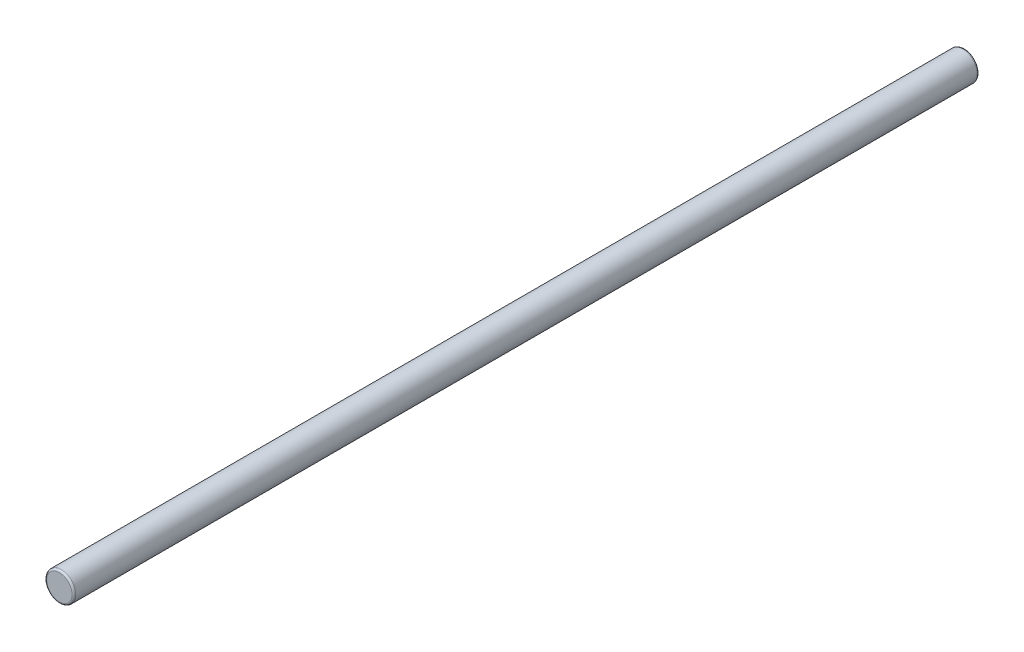
ISO-10303-21;
HEADER;
FILE_DESCRIPTION(('STEP AP214'),'2;1');
FILE_NAME('part.step','',(''),(''),'','','');
FILE_SCHEMA(('AUTOMOTIVE_DESIGN { 1 0 10303 214 1 1 1 1 }'));
ENDSEC;
DATA;
#1=APPLICATION_CONTEXT('core data for automotive mechanical design processes');
#2=APPLICATION_PROTOCOL_DEFINITION('international standard','automotive_design',2000,#1);
#3=PRODUCT_CONTEXT('',#1,'mechanical');
#4=PRODUCT('Part','Part','',(#3));
#5=PRODUCT_RELATED_PRODUCT_CATEGORY('part','',(#4));
#6=PRODUCT_DEFINITION_FORMATION('','',#4);
#7=PRODUCT_DEFINITION_CONTEXT('part definition',#1,'design');
#8=PRODUCT_DEFINITION('design','',#6,#7);
#9=PRODUCT_DEFINITION_SHAPE('','',#8);
#10=(LENGTH_UNIT() NAMED_UNIT(*) SI_UNIT(.MILLI.,.METRE.));
#11=(NAMED_UNIT(*) PLANE_ANGLE_UNIT() SI_UNIT($,.RADIAN.));
#12=(NAMED_UNIT(*) SI_UNIT($,.STERADIAN.) SOLID_ANGLE_UNIT());
#13=UNCERTAINTY_MEASURE_WITH_UNIT(LENGTH_MEASURE(1.E-05),#10,'distance_accuracy_value','');
#14=(GEOMETRIC_REPRESENTATION_CONTEXT(3) GLOBAL_UNCERTAINTY_ASSIGNED_CONTEXT((#13)) GLOBAL_UNIT_ASSIGNED_CONTEXT((#10,
#11,#12)) REPRESENTATION_CONTEXT('',''));
#15=CARTESIAN_POINT('',(0.,0.,0.));
#16=DIRECTION('',(0.,0.,1.));
#17=DIRECTION('',(1.,0.,0.));
#18=AXIS2_PLACEMENT_3D('',#15,#16,#17);
#19=CARTESIAN_POINT('',(0.,0.,250.));
#20=DIRECTION('',(0.,0.,-1.));
#21=DIRECTION('',(-1.,0.,0.));
#22=AXIS2_PLACEMENT_3D('',#19,#20,#21);
#23=CYLINDRICAL_SURFACE('',#22,4.);
#24=CARTESIAN_POINT('',(0.,0.,249.5));
#25=DIRECTION('',(0.,0.,1.));
#26=DIRECTION('',(1.,0.,0.));
#27=AXIS2_PLACEMENT_3D('',#24,#25,#26);
#28=CIRCLE('',#27,4.);
#29=CARTESIAN_POINT('',(4.,0.,249.5));
#30=VERTEX_POINT('',#29);
#31=EDGE_CURVE('E45',#30,#30,#28,.F.);
#32=ORIENTED_EDGE('',*,*,#31,.T.);
#33=EDGE_LOOP('',(#32));
#34=FACE_BOUND('',#33,.T.);
#35=CARTESIAN_POINT('',(0.,0.,0.5));
#36=DIRECTION('',(0.,0.,1.));
#37=DIRECTION('',(1.,0.,0.));
#38=AXIS2_PLACEMENT_3D('',#35,#36,#37);
#39=CIRCLE('',#38,4.);
#40=CARTESIAN_POINT('',(4.,0.,0.5));
#41=VERTEX_POINT('',#40);
#42=EDGE_CURVE('E50',#41,#41,#39,.T.);
#43=ORIENTED_EDGE('',*,*,#42,.T.);
#44=EDGE_LOOP('',(#43));
#45=FACE_BOUND('',#44,.T.);
#46=ADVANCED_FACE('F37',(#34,#45),#23,.T.);
#47=CARTESIAN_POINT('',(0.,0.,250.));
#48=DIRECTION('',(0.,0.,1.));
#49=DIRECTION('',(1.,0.,0.));
#50=AXIS2_PLACEMENT_3D('',#47,#48,#49);
#51=PLANE('',#50);
#52=CARTESIAN_POINT('',(0.,0.,250.));
#53=DIRECTION('',(0.,0.,1.));
#54=DIRECTION('',(1.,0.,0.));
#55=AXIS2_PLACEMENT_3D('',#52,#53,#54);
#56=CIRCLE('',#55,3.5);
#57=CARTESIAN_POINT('',(3.5,0.,250.));
#58=VERTEX_POINT('',#57);
#59=EDGE_CURVE('E55',#58,#58,#56,.T.);
#60=ORIENTED_EDGE('',*,*,#59,.T.);
#61=EDGE_LOOP('',(#60));
#62=FACE_BOUND('',#61,.T.);
#63=ADVANCED_FACE('F62',(#62),#51,.T.);
#64=CARTESIAN_POINT('',(0.,0.,0.));
#65=DIRECTION('',(0.,0.,1.));
#66=DIRECTION('',(1.,0.,0.));
#67=AXIS2_PLACEMENT_3D('',#64,#65,#66);
#68=PLANE('',#67);
#69=CARTESIAN_POINT('',(0.,0.,0.));
#70=DIRECTION('',(0.,0.,1.));
#71=DIRECTION('',(1.,0.,0.));
#72=AXIS2_PLACEMENT_3D('',#69,#70,#71);
#73=CIRCLE('',#72,3.5);
#74=CARTESIAN_POINT('',(3.5,0.,0.));
#75=VERTEX_POINT('',#74);
#76=EDGE_CURVE('E10',#75,#75,#73,.F.);
#77=ORIENTED_EDGE('',*,*,#76,.T.);
#78=EDGE_LOOP('',(#77));
#79=FACE_BOUND('',#78,.T.);
#80=ADVANCED_FACE('F66',(#79),#68,.F.);
#81=CARTESIAN_POINT('',(0.,0.,249.5));
#82=DIRECTION('',(0.,0.,1.));
#83=DIRECTION('',(1.,0.,0.));
#84=AXIS2_PLACEMENT_3D('',#81,#82,#83);
#85=TOROIDAL_SURFACE('',#84,3.5,0.5);
#86=ORIENTED_EDGE('',*,*,#31,.F.);
#87=EDGE_LOOP('',(#86));
#88=FACE_BOUND('',#87,.T.);
#89=ORIENTED_EDGE('',*,*,#59,.F.);
#90=EDGE_LOOP('',(#89));
#91=FACE_BOUND('',#90,.T.);
#92=ADVANCED_FACE('F64',(#88,#91),#85,.T.);
#93=CARTESIAN_POINT('',(0.,0.,0.5));
#94=DIRECTION('',(0.,0.,1.));
#95=DIRECTION('',(1.,0.,0.));
#96=AXIS2_PLACEMENT_3D('',#93,#94,#95);
#97=TOROIDAL_SURFACE('',#96,3.5,0.5);
#98=ORIENTED_EDGE('',*,*,#76,.F.);
#99=EDGE_LOOP('',(#98));
#100=FACE_BOUND('',#99,.T.);
#101=ORIENTED_EDGE('',*,*,#42,.F.);
#102=EDGE_LOOP('',(#101));
#103=FACE_BOUND('',#102,.T.);
#104=ADVANCED_FACE('F39',(#100,#103),#97,.T.);
#105=CLOSED_SHELL('',(#46,#63,#80,#92,#104));
#106=MANIFOLD_SOLID_BREP('B2',#105);
#107=ADVANCED_BREP_SHAPE_REPRESENTATION('',(#18,#106),#14);
#108=SHAPE_DEFINITION_REPRESENTATION(#9,#107);
ENDSEC;
END-ISO-10303-21;
